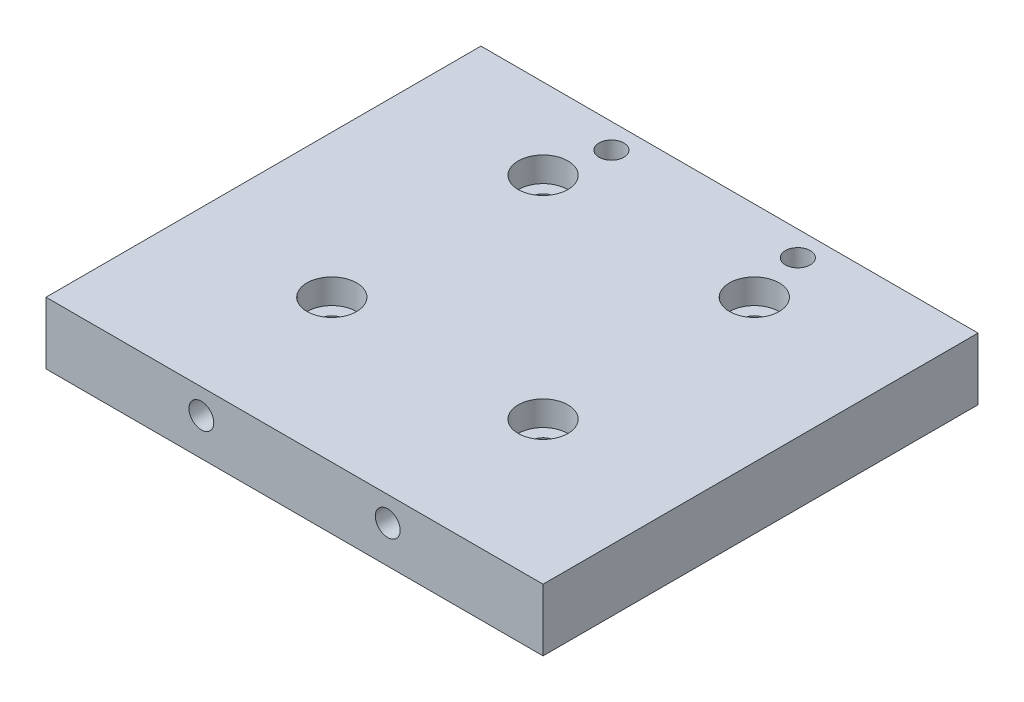
ISO-10303-21;
HEADER;
FILE_DESCRIPTION(('STEP AP214'),'2;1');
FILE_NAME('part.step','',(''),(''),'','','');
FILE_SCHEMA(('AUTOMOTIVE_DESIGN { 1 0 10303 214 1 1 1 1 }'));
ENDSEC;
DATA;
#1=APPLICATION_CONTEXT('core data for automotive mechanical design processes');
#2=APPLICATION_PROTOCOL_DEFINITION('international standard','automotive_design',2000,#1);
#3=PRODUCT_CONTEXT('',#1,'mechanical');
#4=PRODUCT('Part','Part','',(#3));
#5=PRODUCT_RELATED_PRODUCT_CATEGORY('part','',(#4));
#6=PRODUCT_DEFINITION_FORMATION('','',#4);
#7=PRODUCT_DEFINITION_CONTEXT('part definition',#1,'design');
#8=PRODUCT_DEFINITION('design','',#6,#7);
#9=PRODUCT_DEFINITION_SHAPE('','',#8);
#10=(LENGTH_UNIT() NAMED_UNIT(*) SI_UNIT(.MILLI.,.METRE.));
#11=(NAMED_UNIT(*) PLANE_ANGLE_UNIT() SI_UNIT($,.RADIAN.));
#12=(NAMED_UNIT(*) SI_UNIT($,.STERADIAN.) SOLID_ANGLE_UNIT());
#13=UNCERTAINTY_MEASURE_WITH_UNIT(LENGTH_MEASURE(1.E-05),#10,'distance_accuracy_value','');
#14=(GEOMETRIC_REPRESENTATION_CONTEXT(3) GLOBAL_UNCERTAINTY_ASSIGNED_CONTEXT((#13)) GLOBAL_UNIT_ASSIGNED_CONTEXT((#10,
#11,#12)) REPRESENTATION_CONTEXT('',''));
#15=CARTESIAN_POINT('',(0.,0.,0.));
#16=DIRECTION('',(0.,0.,1.));
#17=DIRECTION('',(1.,0.,0.));
#18=AXIS2_PLACEMENT_3D('',#15,#16,#17);
#19=CARTESIAN_POINT('',(-8.5,5.,-8.5));
#20=DIRECTION('',(0.,-1.,0.));
#21=DIRECTION('',(0.,0.,-1.));
#22=AXIS2_PLACEMENT_3D('',#19,#20,#21);
#23=CYLINDRICAL_SURFACE('',#22,1.);
#24=CARTESIAN_POINT('',(-8.5,0.,-8.5));
#25=DIRECTION('',(0.,1.,0.));
#26=DIRECTION('',(0.,0.,1.));
#27=AXIS2_PLACEMENT_3D('',#24,#25,#26);
#28=CIRCLE('',#27,1.);
#29=CARTESIAN_POINT('',(-8.5,0.,-7.5));
#30=VERTEX_POINT('',#29);
#31=EDGE_CURVE('E160',#30,#30,#28,.T.);
#32=ORIENTED_EDGE('',*,*,#31,.F.);
#33=EDGE_LOOP('',(#32));
#34=FACE_BOUND('',#33,.T.);
#35=CARTESIAN_POINT('',(-8.5,3.,-8.5));
#36=DIRECTION('',(0.,1.,0.));
#37=DIRECTION('',(0.,0.,1.));
#38=AXIS2_PLACEMENT_3D('',#35,#36,#37);
#39=CIRCLE('',#38,1.);
#40=CARTESIAN_POINT('',(-8.5,3.,-7.5));
#41=VERTEX_POINT('',#40);
#42=EDGE_CURVE('E41',#41,#41,#39,.T.);
#43=ORIENTED_EDGE('',*,*,#42,.T.);
#44=EDGE_LOOP('',(#43));
#45=FACE_BOUND('',#44,.T.);
#46=ADVANCED_FACE('F37',(#34,#45),#23,.F.);
#47=CARTESIAN_POINT('',(8.5,5.,-8.50000000000001));
#48=DIRECTION('',(0.,-1.,0.));
#49=DIRECTION('',(0.,0.,-1.));
#50=AXIS2_PLACEMENT_3D('',#47,#48,#49);
#51=CYLINDRICAL_SURFACE('',#50,1.);
#52=CARTESIAN_POINT('',(8.5,0.,-8.50000000000001));
#53=DIRECTION('',(0.,1.,0.));
#54=DIRECTION('',(0.,0.,1.));
#55=AXIS2_PLACEMENT_3D('',#52,#53,#54);
#56=CIRCLE('',#55,1.);
#57=CARTESIAN_POINT('',(8.5,0.,-7.5));
#58=VERTEX_POINT('',#57);
#59=EDGE_CURVE('E157',#58,#58,#56,.T.);
#60=ORIENTED_EDGE('',*,*,#59,.F.);
#61=EDGE_LOOP('',(#60));
#62=FACE_BOUND('',#61,.T.);
#63=CARTESIAN_POINT('',(8.5,3.,-8.50000000000001));
#64=DIRECTION('',(0.,1.,0.));
#65=DIRECTION('',(0.,0.,1.));
#66=AXIS2_PLACEMENT_3D('',#63,#64,#65);
#67=CIRCLE('',#66,1.);
#68=CARTESIAN_POINT('',(8.5,3.,-7.5));
#69=VERTEX_POINT('',#68);
#70=EDGE_CURVE('E173',#69,#69,#67,.T.);
#71=ORIENTED_EDGE('',*,*,#70,.T.);
#72=EDGE_LOOP('',(#71));
#73=FACE_BOUND('',#72,.T.);
#74=ADVANCED_FACE('F214',(#62,#73),#51,.F.);
#75=CARTESIAN_POINT('',(8.5,5.,8.50000000000001));
#76=DIRECTION('',(0.,-1.,0.));
#77=DIRECTION('',(0.,0.,-1.));
#78=AXIS2_PLACEMENT_3D('',#75,#76,#77);
#79=CYLINDRICAL_SURFACE('',#78,1.);
#80=CARTESIAN_POINT('',(8.5,0.,8.50000000000001));
#81=DIRECTION('',(0.,1.,0.));
#82=DIRECTION('',(0.,0.,1.));
#83=AXIS2_PLACEMENT_3D('',#80,#81,#82);
#84=CIRCLE('',#83,1.);
#85=CARTESIAN_POINT('',(8.5,0.,9.50000000000001));
#86=VERTEX_POINT('',#85);
#87=EDGE_CURVE('E154',#86,#86,#84,.T.);
#88=ORIENTED_EDGE('',*,*,#87,.F.);
#89=EDGE_LOOP('',(#88));
#90=FACE_BOUND('',#89,.T.);
#91=CARTESIAN_POINT('',(8.5,3.,8.50000000000001));
#92=DIRECTION('',(0.,1.,0.));
#93=DIRECTION('',(0.,0.,1.));
#94=AXIS2_PLACEMENT_3D('',#91,#92,#93);
#95=CIRCLE('',#94,1.);
#96=CARTESIAN_POINT('',(8.5,3.,9.50000000000001));
#97=VERTEX_POINT('',#96);
#98=EDGE_CURVE('E171',#97,#97,#95,.T.);
#99=ORIENTED_EDGE('',*,*,#98,.T.);
#100=EDGE_LOOP('',(#99));
#101=FACE_BOUND('',#100,.T.);
#102=ADVANCED_FACE('F220',(#90,#101),#79,.F.);
#103=CARTESIAN_POINT('',(-8.5,5.,8.5));
#104=DIRECTION('',(0.,-1.,0.));
#105=DIRECTION('',(0.,0.,-1.));
#106=AXIS2_PLACEMENT_3D('',#103,#104,#105);
#107=CYLINDRICAL_SURFACE('',#106,1.);
#108=CARTESIAN_POINT('',(-8.5,0.,8.5));
#109=DIRECTION('',(0.,1.,0.));
#110=DIRECTION('',(0.,0.,1.));
#111=AXIS2_PLACEMENT_3D('',#108,#109,#110);
#112=CIRCLE('',#111,1.);
#113=CARTESIAN_POINT('',(-8.5,0.,9.5));
#114=VERTEX_POINT('',#113);
#115=EDGE_CURVE('E151',#114,#114,#112,.T.);
#116=ORIENTED_EDGE('',*,*,#115,.F.);
#117=EDGE_LOOP('',(#116));
#118=FACE_BOUND('',#117,.T.);
#119=CARTESIAN_POINT('',(-8.5,3.,8.5));
#120=DIRECTION('',(0.,1.,0.));
#121=DIRECTION('',(0.,0.,1.));
#122=AXIS2_PLACEMENT_3D('',#119,#120,#121);
#123=CIRCLE('',#122,1.);
#124=CARTESIAN_POINT('',(-8.5,3.,9.5));
#125=VERTEX_POINT('',#124);
#126=EDGE_CURVE('E148',#125,#125,#123,.T.);
#127=ORIENTED_EDGE('',*,*,#126,.T.);
#128=EDGE_LOOP('',(#127));
#129=FACE_BOUND('',#128,.T.);
#130=ADVANCED_FACE('F197',(#118,#129),#107,.F.);
#131=CARTESIAN_POINT('',(0.,5.,0.));
#132=DIRECTION('',(0.,1.,0.));
#133=DIRECTION('',(0.,0.,1.));
#134=AXIS2_PLACEMENT_3D('',#131,#132,#133);
#135=PLANE('',#134);
#136=CARTESIAN_POINT('',(-7.5,5.,-13.));
#137=DIRECTION('',(0.,-1.,0.));
#138=DIRECTION('',(0.,0.,-1.));
#139=AXIS2_PLACEMENT_3D('',#136,#137,#138);
#140=CIRCLE('',#139,1.);
#141=CARTESIAN_POINT('',(-7.5,5.,-14.));
#142=VERTEX_POINT('',#141);
#143=EDGE_CURVE('E115',#142,#142,#140,.T.);
#144=ORIENTED_EDGE('',*,*,#143,.T.);
#145=EDGE_LOOP('',(#144));
#146=FACE_BOUND('',#145,.T.);
#147=CARTESIAN_POINT('',(7.5,5.,-13.));
#148=DIRECTION('',(0.,-1.,0.));
#149=DIRECTION('',(0.,0.,-1.));
#150=AXIS2_PLACEMENT_3D('',#147,#148,#149);
#151=CIRCLE('',#150,1.);
#152=CARTESIAN_POINT('',(7.5,5.,-14.));
#153=VERTEX_POINT('',#152);
#154=EDGE_CURVE('E114',#153,#153,#151,.T.);
#155=ORIENTED_EDGE('',*,*,#154,.T.);
#156=EDGE_LOOP('',(#155));
#157=FACE_BOUND('',#156,.T.);
#158=CARTESIAN_POINT('',(-8.5,5.,8.5));
#159=DIRECTION('',(0.,1.,0.));
#160=DIRECTION('',(0.,0.,1.));
#161=AXIS2_PLACEMENT_3D('',#158,#159,#160);
#162=CIRCLE('',#161,2.);
#163=CARTESIAN_POINT('',(-8.5,5.,10.5));
#164=VERTEX_POINT('',#163);
#165=EDGE_CURVE('E140',#164,#164,#162,.T.);
#166=ORIENTED_EDGE('',*,*,#165,.F.);
#167=EDGE_LOOP('',(#166));
#168=FACE_BOUND('',#167,.T.);
#169=CARTESIAN_POINT('',(8.5,5.,8.50000000000001));
#170=DIRECTION('',(0.,1.,0.));
#171=DIRECTION('',(0.,0.,1.));
#172=AXIS2_PLACEMENT_3D('',#169,#170,#171);
#173=CIRCLE('',#172,2.);
#174=CARTESIAN_POINT('',(8.5,5.,10.5));
#175=VERTEX_POINT('',#174);
#176=EDGE_CURVE('E134',#175,#175,#173,.T.);
#177=ORIENTED_EDGE('',*,*,#176,.F.);
#178=EDGE_LOOP('',(#177));
#179=FACE_BOUND('',#178,.T.);
#180=CARTESIAN_POINT('',(8.5,5.,-8.50000000000001));
#181=DIRECTION('',(0.,1.,0.));
#182=DIRECTION('',(0.,0.,1.));
#183=AXIS2_PLACEMENT_3D('',#180,#181,#182);
#184=CIRCLE('',#183,2.);
#185=CARTESIAN_POINT('',(8.5,5.,-6.50000000000001));
#186=VERTEX_POINT('',#185);
#187=EDGE_CURVE('E127',#186,#186,#184,.T.);
#188=ORIENTED_EDGE('',*,*,#187,.F.);
#189=EDGE_LOOP('',(#188));
#190=FACE_BOUND('',#189,.T.);
#191=CARTESIAN_POINT('',(-8.5,5.,-8.5));
#192=DIRECTION('',(0.,1.,0.));
#193=DIRECTION('',(0.,0.,1.));
#194=AXIS2_PLACEMENT_3D('',#191,#192,#193);
#195=CIRCLE('',#194,2.);
#196=CARTESIAN_POINT('',(-8.5,5.,-6.5));
#197=VERTEX_POINT('',#196);
#198=EDGE_CURVE('E130',#197,#197,#195,.T.);
#199=ORIENTED_EDGE('',*,*,#198,.F.);
#200=EDGE_LOOP('',(#199));
#201=FACE_BOUND('',#200,.T.);
#202=DIRECTION('',(0.,0.,-1.));
#203=VECTOR('',#202,1.);
#204=CARTESIAN_POINT('',(20.,5.,-15.));
#205=LINE('',#204,#203);
#206=CARTESIAN_POINT('',(20.,5.,20.));
#207=VERTEX_POINT('',#206);
#208=CARTESIAN_POINT('',(20.,5.,-15.));
#209=VERTEX_POINT('',#208);
#210=EDGE_CURVE('E88',#207,#209,#205,.T.);
#211=ORIENTED_EDGE('',*,*,#210,.T.);
#212=DIRECTION('',(-1.,0.,0.));
#213=VECTOR('',#212,1.);
#214=CARTESIAN_POINT('',(-20.,5.,-15.));
#215=LINE('',#214,#213);
#216=CARTESIAN_POINT('',(-20.,5.,-15.));
#217=VERTEX_POINT('',#216);
#218=EDGE_CURVE('E56',#209,#217,#215,.T.);
#219=ORIENTED_EDGE('',*,*,#218,.T.);
#220=DIRECTION('',(0.,0.,1.));
#221=VECTOR('',#220,1.);
#222=CARTESIAN_POINT('',(-20.,5.,-15.));
#223=LINE('',#222,#221);
#224=CARTESIAN_POINT('',(-20.,5.,20.));
#225=VERTEX_POINT('',#224);
#226=EDGE_CURVE('E71',#217,#225,#223,.T.);
#227=ORIENTED_EDGE('',*,*,#226,.T.);
#228=DIRECTION('',(-1.,0.,0.));
#229=VECTOR('',#228,1.);
#230=CARTESIAN_POINT('',(-20.,5.,20.));
#231=LINE('',#230,#229);
#232=EDGE_CURVE('E102',#207,#225,#231,.T.);
#233=ORIENTED_EDGE('',*,*,#232,.F.);
#234=EDGE_LOOP('',(#211,#219,#227,#233));
#235=FACE_BOUND('',#234,.T.);
#236=ADVANCED_FACE('F195',(#146,#157,#168,#179,#190,#201,#235),#135,.T.);
#237=CARTESIAN_POINT('',(0.,0.,0.));
#238=DIRECTION('',(0.,1.,0.));
#239=DIRECTION('',(0.,0.,1.));
#240=AXIS2_PLACEMENT_3D('',#237,#238,#239);
#241=PLANE('',#240);
#242=CARTESIAN_POINT('',(-7.5,0.,-13.));
#243=DIRECTION('',(0.,-1.,0.));
#244=DIRECTION('',(0.,0.,-1.));
#245=AXIS2_PLACEMENT_3D('',#242,#243,#244);
#246=CIRCLE('',#245,1.);
#247=CARTESIAN_POINT('',(-7.5,0.,-14.));
#248=VERTEX_POINT('',#247);
#249=EDGE_CURVE('E119',#248,#248,#246,.T.);
#250=ORIENTED_EDGE('',*,*,#249,.F.);
#251=EDGE_LOOP('',(#250));
#252=FACE_BOUND('',#251,.T.);
#253=CARTESIAN_POINT('',(7.5,0.,-13.));
#254=DIRECTION('',(0.,-1.,0.));
#255=DIRECTION('',(0.,0.,-1.));
#256=AXIS2_PLACEMENT_3D('',#253,#254,#255);
#257=CIRCLE('',#256,1.);
#258=CARTESIAN_POINT('',(7.5,0.,-14.));
#259=VERTEX_POINT('',#258);
#260=EDGE_CURVE('E122',#259,#259,#257,.T.);
#261=ORIENTED_EDGE('',*,*,#260,.F.);
#262=EDGE_LOOP('',(#261));
#263=FACE_BOUND('',#262,.T.);
#264=DIRECTION('',(0.,0.,-1.));
#265=VECTOR('',#264,1.);
#266=CARTESIAN_POINT('',(20.,0.,-15.));
#267=LINE('',#266,#265);
#268=CARTESIAN_POINT('',(20.,0.,20.));
#269=VERTEX_POINT('',#268);
#270=CARTESIAN_POINT('',(20.,0.,-15.));
#271=VERTEX_POINT('',#270);
#272=EDGE_CURVE('E95',#269,#271,#267,.T.);
#273=ORIENTED_EDGE('',*,*,#272,.F.);
#274=DIRECTION('',(1.,0.,0.));
#275=VECTOR('',#274,1.);
#276=CARTESIAN_POINT('',(-20.,0.,20.));
#277=LINE('',#276,#275);
#278=CARTESIAN_POINT('',(-20.,0.,20.));
#279=VERTEX_POINT('',#278);
#280=EDGE_CURVE('E91',#279,#269,#277,.T.);
#281=ORIENTED_EDGE('',*,*,#280,.F.);
#282=DIRECTION('',(0.,0.,1.));
#283=VECTOR('',#282,1.);
#284=CARTESIAN_POINT('',(-20.,0.,-15.));
#285=LINE('',#284,#283);
#286=CARTESIAN_POINT('',(-20.,0.,-15.));
#287=VERTEX_POINT('',#286);
#288=EDGE_CURVE('E83',#287,#279,#285,.T.);
#289=ORIENTED_EDGE('',*,*,#288,.F.);
#290=DIRECTION('',(-1.,0.,0.));
#291=VECTOR('',#290,1.);
#292=CARTESIAN_POINT('',(-20.,0.,-15.));
#293=LINE('',#292,#291);
#294=EDGE_CURVE('E67',#271,#287,#293,.T.);
#295=ORIENTED_EDGE('',*,*,#294,.F.);
#296=EDGE_LOOP('',(#273,#281,#289,#295));
#297=FACE_BOUND('',#296,.T.);
#298=ORIENTED_EDGE('',*,*,#31,.T.);
#299=EDGE_LOOP('',(#298));
#300=FACE_BOUND('',#299,.T.);
#301=ORIENTED_EDGE('',*,*,#59,.T.);
#302=EDGE_LOOP('',(#301));
#303=FACE_BOUND('',#302,.T.);
#304=ORIENTED_EDGE('',*,*,#87,.T.);
#305=EDGE_LOOP('',(#304));
#306=FACE_BOUND('',#305,.T.);
#307=ORIENTED_EDGE('',*,*,#115,.T.);
#308=EDGE_LOOP('',(#307));
#309=FACE_BOUND('',#308,.T.);
#310=ADVANCED_FACE('F92',(#252,#263,#297,#300,#303,#306,#309),#241,.F.);
#311=CARTESIAN_POINT('',(20.,5.,-15.));
#312=DIRECTION('',(-1.,0.,0.));
#313=DIRECTION('',(0.,0.,1.));
#314=AXIS2_PLACEMENT_3D('',#311,#312,#313);
#315=PLANE('',#314);
#316=ORIENTED_EDGE('',*,*,#272,.T.);
#317=DIRECTION('',(0.,-1.,0.));
#318=VECTOR('',#317,1.);
#319=CARTESIAN_POINT('',(20.,5.,-15.));
#320=LINE('',#319,#318);
#321=EDGE_CURVE('E11',#209,#271,#320,.T.);
#322=ORIENTED_EDGE('',*,*,#321,.F.);
#323=ORIENTED_EDGE('',*,*,#210,.F.);
#324=DIRECTION('',(0.,1.,0.));
#325=VECTOR('',#324,1.);
#326=CARTESIAN_POINT('',(20.,5.,20.));
#327=LINE('',#326,#325);
#328=EDGE_CURVE('E99',#269,#207,#327,.T.);
#329=ORIENTED_EDGE('',*,*,#328,.F.);
#330=EDGE_LOOP('',(#316,#322,#323,#329));
#331=FACE_BOUND('',#330,.T.);
#332=ADVANCED_FACE('F39',(#331),#315,.F.);
#333=CARTESIAN_POINT('',(-20.,5.,-15.));
#334=DIRECTION('',(0.,0.,1.));
#335=DIRECTION('',(1.,0.,0.));
#336=AXIS2_PLACEMENT_3D('',#333,#334,#335);
#337=PLANE('',#336);
#338=ORIENTED_EDGE('',*,*,#294,.T.);
#339=DIRECTION('',(0.,-1.,0.));
#340=VECTOR('',#339,1.);
#341=CARTESIAN_POINT('',(-20.,5.,-15.));
#342=LINE('',#341,#340);
#343=EDGE_CURVE('E47',#217,#287,#342,.T.);
#344=ORIENTED_EDGE('',*,*,#343,.F.);
#345=ORIENTED_EDGE('',*,*,#218,.F.);
#346=ORIENTED_EDGE('',*,*,#321,.T.);
#347=EDGE_LOOP('',(#338,#344,#345,#346));
#348=FACE_BOUND('',#347,.T.);
#349=ADVANCED_FACE('F203',(#348),#337,.F.);
#350=CARTESIAN_POINT('',(-20.,5.,-15.));
#351=DIRECTION('',(1.,0.,0.));
#352=DIRECTION('',(0.,0.,-1.));
#353=AXIS2_PLACEMENT_3D('',#350,#351,#352);
#354=PLANE('',#353);
#355=ORIENTED_EDGE('',*,*,#288,.T.);
#356=DIRECTION('',(0.,-1.,0.));
#357=VECTOR('',#356,1.);
#358=CARTESIAN_POINT('',(-20.,5.,20.));
#359=LINE('',#358,#357);
#360=EDGE_CURVE('E87',#225,#279,#359,.T.);
#361=ORIENTED_EDGE('',*,*,#360,.F.);
#362=ORIENTED_EDGE('',*,*,#226,.F.);
#363=ORIENTED_EDGE('',*,*,#343,.T.);
#364=EDGE_LOOP('',(#355,#361,#362,#363));
#365=FACE_BOUND('',#364,.T.);
#366=ADVANCED_FACE('F85',(#365),#354,.F.);
#367=CARTESIAN_POINT('',(-8.5,3.,8.5));
#368=DIRECTION('',(0.,1.,0.));
#369=DIRECTION('',(0.,0.,1.));
#370=AXIS2_PLACEMENT_3D('',#367,#368,#369);
#371=CYLINDRICAL_SURFACE('',#370,2.);
#372=CARTESIAN_POINT('',(-8.5,3.,8.5));
#373=DIRECTION('',(0.,1.,0.));
#374=DIRECTION('',(0.,0.,1.));
#375=AXIS2_PLACEMENT_3D('',#372,#373,#374);
#376=CIRCLE('',#375,2.);
#377=CARTESIAN_POINT('',(-8.5,3.,10.5));
#378=VERTEX_POINT('',#377);
#379=EDGE_CURVE('E118',#378,#378,#376,.T.);
#380=ORIENTED_EDGE('',*,*,#379,.F.);
#381=EDGE_LOOP('',(#380));
#382=FACE_BOUND('',#381,.T.);
#383=ORIENTED_EDGE('',*,*,#165,.T.);
#384=EDGE_LOOP('',(#383));
#385=FACE_BOUND('',#384,.T.);
#386=ADVANCED_FACE('F210',(#382,#385),#371,.F.);
#387=CARTESIAN_POINT('',(-8.5,3.,8.5));
#388=DIRECTION('',(0.,1.,0.));
#389=DIRECTION('',(0.,0.,1.));
#390=AXIS2_PLACEMENT_3D('',#387,#388,#389);
#391=PLANE('',#390);
#392=ORIENTED_EDGE('',*,*,#126,.F.);
#393=EDGE_LOOP('',(#392));
#394=FACE_BOUND('',#393,.T.);
#395=ORIENTED_EDGE('',*,*,#379,.T.);
#396=EDGE_LOOP('',(#395));
#397=FACE_BOUND('',#396,.T.);
#398=ADVANCED_FACE('F257',(#394,#397),#391,.T.);
#399=CARTESIAN_POINT('',(8.5,3.,8.50000000000001));
#400=DIRECTION('',(0.,1.,0.));
#401=DIRECTION('',(0.,0.,1.));
#402=AXIS2_PLACEMENT_3D('',#399,#400,#401);
#403=CYLINDRICAL_SURFACE('',#402,2.);
#404=CARTESIAN_POINT('',(8.5,3.,8.50000000000001));
#405=DIRECTION('',(0.,1.,0.));
#406=DIRECTION('',(0.,0.,1.));
#407=AXIS2_PLACEMENT_3D('',#404,#405,#406);
#408=CIRCLE('',#407,2.);
#409=CARTESIAN_POINT('',(8.5,3.,10.5));
#410=VERTEX_POINT('',#409);
#411=EDGE_CURVE('E137',#410,#410,#408,.T.);
#412=ORIENTED_EDGE('',*,*,#411,.F.);
#413=EDGE_LOOP('',(#412));
#414=FACE_BOUND('',#413,.T.);
#415=ORIENTED_EDGE('',*,*,#176,.T.);
#416=EDGE_LOOP('',(#415));
#417=FACE_BOUND('',#416,.T.);
#418=ADVANCED_FACE('F254',(#414,#417),#403,.F.);
#419=CARTESIAN_POINT('',(8.5,3.,8.50000000000001));
#420=DIRECTION('',(0.,1.,0.));
#421=DIRECTION('',(0.,0.,1.));
#422=AXIS2_PLACEMENT_3D('',#419,#420,#421);
#423=PLANE('',#422);
#424=ORIENTED_EDGE('',*,*,#98,.F.);
#425=EDGE_LOOP('',(#424));
#426=FACE_BOUND('',#425,.T.);
#427=ORIENTED_EDGE('',*,*,#411,.T.);
#428=EDGE_LOOP('',(#427));
#429=FACE_BOUND('',#428,.T.);
#430=ADVANCED_FACE('F249',(#426,#429),#423,.T.);
#431=CARTESIAN_POINT('',(8.5,3.,-8.50000000000001));
#432=DIRECTION('',(0.,1.,0.));
#433=DIRECTION('',(0.,0.,1.));
#434=AXIS2_PLACEMENT_3D('',#431,#432,#433);
#435=CYLINDRICAL_SURFACE('',#434,2.);
#436=CARTESIAN_POINT('',(8.5,3.,-8.50000000000001));
#437=DIRECTION('',(0.,1.,0.));
#438=DIRECTION('',(0.,0.,1.));
#439=AXIS2_PLACEMENT_3D('',#436,#437,#438);
#440=CIRCLE('',#439,2.);
#441=CARTESIAN_POINT('',(8.5,3.,-6.50000000000001));
#442=VERTEX_POINT('',#441);
#443=EDGE_CURVE('E131',#442,#442,#440,.T.);
#444=ORIENTED_EDGE('',*,*,#443,.F.);
#445=EDGE_LOOP('',(#444));
#446=FACE_BOUND('',#445,.T.);
#447=ORIENTED_EDGE('',*,*,#187,.T.);
#448=EDGE_LOOP('',(#447));
#449=FACE_BOUND('',#448,.T.);
#450=ADVANCED_FACE('F246',(#446,#449),#435,.F.);
#451=CARTESIAN_POINT('',(8.5,3.,-8.50000000000001));
#452=DIRECTION('',(0.,1.,0.));
#453=DIRECTION('',(0.,0.,1.));
#454=AXIS2_PLACEMENT_3D('',#451,#452,#453);
#455=PLANE('',#454);
#456=ORIENTED_EDGE('',*,*,#70,.F.);
#457=EDGE_LOOP('',(#456));
#458=FACE_BOUND('',#457,.T.);
#459=ORIENTED_EDGE('',*,*,#443,.T.);
#460=EDGE_LOOP('',(#459));
#461=FACE_BOUND('',#460,.T.);
#462=ADVANCED_FACE('F191',(#458,#461),#455,.T.);
#463=CARTESIAN_POINT('',(-8.5,3.,-8.5));
#464=DIRECTION('',(0.,1.,0.));
#465=DIRECTION('',(0.,0.,1.));
#466=AXIS2_PLACEMENT_3D('',#463,#464,#465);
#467=CYLINDRICAL_SURFACE('',#466,2.);
#468=CARTESIAN_POINT('',(-8.5,3.,-8.5));
#469=DIRECTION('',(0.,1.,0.));
#470=DIRECTION('',(0.,0.,1.));
#471=AXIS2_PLACEMENT_3D('',#468,#469,#470);
#472=CIRCLE('',#471,2.);
#473=CARTESIAN_POINT('',(-8.5,3.,-6.5));
#474=VERTEX_POINT('',#473);
#475=EDGE_CURVE('E145',#474,#474,#472,.T.);
#476=ORIENTED_EDGE('',*,*,#475,.F.);
#477=EDGE_LOOP('',(#476));
#478=FACE_BOUND('',#477,.T.);
#479=ORIENTED_EDGE('',*,*,#198,.T.);
#480=EDGE_LOOP('',(#479));
#481=FACE_BOUND('',#480,.T.);
#482=ADVANCED_FACE('F185',(#478,#481),#467,.F.);
#483=CARTESIAN_POINT('',(-8.5,3.,-8.5));
#484=DIRECTION('',(0.,1.,0.));
#485=DIRECTION('',(0.,0.,1.));
#486=AXIS2_PLACEMENT_3D('',#483,#484,#485);
#487=PLANE('',#486);
#488=ORIENTED_EDGE('',*,*,#42,.F.);
#489=EDGE_LOOP('',(#488));
#490=FACE_BOUND('',#489,.T.);
#491=ORIENTED_EDGE('',*,*,#475,.T.);
#492=EDGE_LOOP('',(#491));
#493=FACE_BOUND('',#492,.T.);
#494=ADVANCED_FACE('F181',(#490,#493),#487,.T.);
#495=CARTESIAN_POINT('',(7.5,5.,-13.));
#496=DIRECTION('',(0.,-1.,0.));
#497=DIRECTION('',(0.,0.,-1.));
#498=AXIS2_PLACEMENT_3D('',#495,#496,#497);
#499=CYLINDRICAL_SURFACE('',#498,1.);
#500=ORIENTED_EDGE('',*,*,#154,.F.);
#501=EDGE_LOOP('',(#500));
#502=FACE_BOUND('',#501,.T.);
#503=ORIENTED_EDGE('',*,*,#260,.T.);
#504=EDGE_LOOP('',(#503));
#505=FACE_BOUND('',#504,.T.);
#506=ADVANCED_FACE('F184',(#502,#505),#499,.F.);
#507=CARTESIAN_POINT('',(-7.5,5.,-13.));
#508=DIRECTION('',(0.,-1.,0.));
#509=DIRECTION('',(0.,0.,-1.));
#510=AXIS2_PLACEMENT_3D('',#507,#508,#509);
#511=CYLINDRICAL_SURFACE('',#510,1.);
#512=ORIENTED_EDGE('',*,*,#143,.F.);
#513=EDGE_LOOP('',(#512));
#514=FACE_BOUND('',#513,.T.);
#515=ORIENTED_EDGE('',*,*,#249,.T.);
#516=EDGE_LOOP('',(#515));
#517=FACE_BOUND('',#516,.T.);
#518=ADVANCED_FACE('F235',(#514,#517),#511,.F.);
#519=CARTESIAN_POINT('',(0.,0.,20.));
#520=DIRECTION('',(0.,0.,1.));
#521=DIRECTION('',(1.,0.,0.));
#522=AXIS2_PLACEMENT_3D('',#519,#520,#521);
#523=PLANE('',#522);
#524=CARTESIAN_POINT('',(-7.5,3.,20.));
#525=DIRECTION('',(0.,0.,1.));
#526=DIRECTION('',(1.,0.,0.));
#527=AXIS2_PLACEMENT_3D('',#524,#525,#526);
#528=CIRCLE('',#527,1.);
#529=CARTESIAN_POINT('',(-6.5,3.,20.));
#530=VERTEX_POINT('',#529);
#531=EDGE_CURVE('E106',#530,#530,#528,.T.);
#532=ORIENTED_EDGE('',*,*,#531,.F.);
#533=EDGE_LOOP('',(#532));
#534=FACE_BOUND('',#533,.T.);
#535=CARTESIAN_POINT('',(7.5,3.,20.));
#536=DIRECTION('',(0.,0.,1.));
#537=DIRECTION('',(1.,0.,0.));
#538=AXIS2_PLACEMENT_3D('',#535,#536,#537);
#539=CIRCLE('',#538,1.);
#540=CARTESIAN_POINT('',(8.5,3.,20.));
#541=VERTEX_POINT('',#540);
#542=EDGE_CURVE('E509',#541,#541,#539,.T.);
#543=ORIENTED_EDGE('',*,*,#542,.F.);
#544=EDGE_LOOP('',(#543));
#545=FACE_BOUND('',#544,.T.);
#546=ORIENTED_EDGE('',*,*,#360,.T.);
#547=ORIENTED_EDGE('',*,*,#280,.T.);
#548=ORIENTED_EDGE('',*,*,#328,.T.);
#549=ORIENTED_EDGE('',*,*,#232,.T.);
#550=EDGE_LOOP('',(#546,#547,#548,#549));
#551=FACE_BOUND('',#550,.T.);
#552=ADVANCED_FACE('F101',(#534,#545,#551),#523,.T.);
#553=CARTESIAN_POINT('',(7.5,3.,15.));
#554=DIRECTION('',(0.,0.,1.));
#555=DIRECTION('',(1.,0.,0.));
#556=AXIS2_PLACEMENT_3D('',#553,#554,#555);
#557=CYLINDRICAL_SURFACE('',#556,1.);
#558=CARTESIAN_POINT('',(7.5,3.,15.));
#559=DIRECTION('',(0.,0.,1.));
#560=DIRECTION('',(1.,0.,0.));
#561=AXIS2_PLACEMENT_3D('',#558,#559,#560);
#562=CIRCLE('',#561,1.);
#563=CARTESIAN_POINT('',(8.5,3.,15.));
#564=VERTEX_POINT('',#563);
#565=EDGE_CURVE('E109',#564,#564,#562,.T.);
#566=ORIENTED_EDGE('',*,*,#565,.F.);
#567=EDGE_LOOP('',(#566));
#568=FACE_BOUND('',#567,.T.);
#569=ORIENTED_EDGE('',*,*,#542,.T.);
#570=EDGE_LOOP('',(#569));
#571=FACE_BOUND('',#570,.T.);
#572=ADVANCED_FACE('F404',(#568,#571),#557,.F.);
#573=CARTESIAN_POINT('',(7.5,3.,15.));
#574=DIRECTION('',(0.,0.,1.));
#575=DIRECTION('',(1.,0.,0.));
#576=AXIS2_PLACEMENT_3D('',#573,#574,#575);
#577=PLANE('',#576);
#578=ORIENTED_EDGE('',*,*,#565,.T.);
#579=EDGE_LOOP('',(#578));
#580=FACE_BOUND('',#579,.T.);
#581=ADVANCED_FACE('F411',(#580),#577,.T.);
#582=CARTESIAN_POINT('',(-7.5,3.,15.));
#583=DIRECTION('',(0.,0.,1.));
#584=DIRECTION('',(1.,0.,0.));
#585=AXIS2_PLACEMENT_3D('',#582,#583,#584);
#586=CYLINDRICAL_SURFACE('',#585,1.);
#587=CARTESIAN_POINT('',(-7.5,3.,15.));
#588=DIRECTION('',(0.,0.,1.));
#589=DIRECTION('',(1.,0.,0.));
#590=AXIS2_PLACEMENT_3D('',#587,#588,#589);
#591=CIRCLE('',#590,1.);
#592=CARTESIAN_POINT('',(-6.5,3.,15.));
#593=VERTEX_POINT('',#592);
#594=EDGE_CURVE('E103',#593,#593,#591,.T.);
#595=ORIENTED_EDGE('',*,*,#594,.F.);
#596=EDGE_LOOP('',(#595));
#597=FACE_BOUND('',#596,.T.);
#598=ORIENTED_EDGE('',*,*,#531,.T.);
#599=EDGE_LOOP('',(#598));
#600=FACE_BOUND('',#599,.T.);
#601=ADVANCED_FACE('F422',(#597,#600),#586,.F.);
#602=CARTESIAN_POINT('',(-7.5,3.,15.));
#603=DIRECTION('',(0.,0.,1.));
#604=DIRECTION('',(1.,0.,0.));
#605=AXIS2_PLACEMENT_3D('',#602,#603,#604);
#606=PLANE('',#605);
#607=ORIENTED_EDGE('',*,*,#594,.T.);
#608=EDGE_LOOP('',(#607));
#609=FACE_BOUND('',#608,.T.);
#610=ADVANCED_FACE('F433',(#609),#606,.T.);
#611=CLOSED_SHELL('',(#46,#74,#102,#130,#236,#310,#332,#349,#366,#386,#398,#418,#430,#450,#462,
#482,#494,#506,#518,#552,#572,#581,#601,#610));
#612=MANIFOLD_SOLID_BREP('B2',#611);
#613=ADVANCED_BREP_SHAPE_REPRESENTATION('',(#18,#612),#14);
#614=SHAPE_DEFINITION_REPRESENTATION(#9,#613);
ENDSEC;
END-ISO-10303-21;
